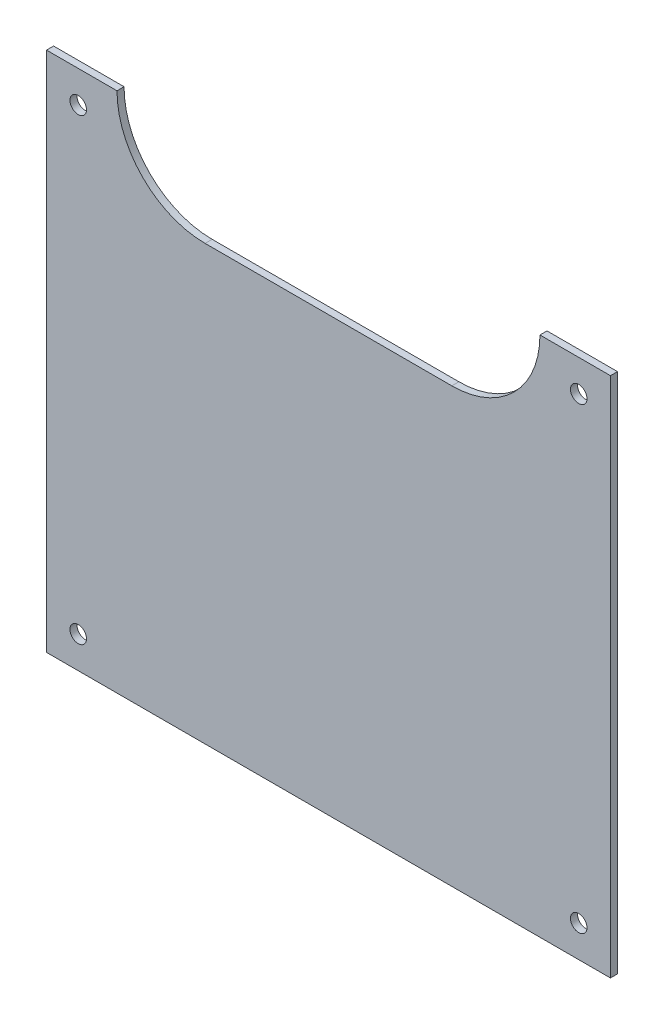
ISO-10303-21;
HEADER;
FILE_DESCRIPTION(('STEP AP214'),'2;1');
FILE_NAME('part.step','',(''),(''),'','','');
FILE_SCHEMA(('AUTOMOTIVE_DESIGN { 1 0 10303 214 1 1 1 1 }'));
ENDSEC;
DATA;
#1=APPLICATION_CONTEXT('core data for automotive mechanical design processes');
#2=APPLICATION_PROTOCOL_DEFINITION('international standard','automotive_design',2000,#1);
#3=PRODUCT_CONTEXT('',#1,'mechanical');
#4=PRODUCT('Part','Part','',(#3));
#5=PRODUCT_RELATED_PRODUCT_CATEGORY('part','',(#4));
#6=PRODUCT_DEFINITION_FORMATION('','',#4);
#7=PRODUCT_DEFINITION_CONTEXT('part definition',#1,'design');
#8=PRODUCT_DEFINITION('design','',#6,#7);
#9=PRODUCT_DEFINITION_SHAPE('','',#8);
#10=(LENGTH_UNIT() NAMED_UNIT(*) SI_UNIT(.MILLI.,.METRE.));
#11=(NAMED_UNIT(*) PLANE_ANGLE_UNIT() SI_UNIT($,.RADIAN.));
#12=(NAMED_UNIT(*) SI_UNIT($,.STERADIAN.) SOLID_ANGLE_UNIT());
#13=UNCERTAINTY_MEASURE_WITH_UNIT(LENGTH_MEASURE(1.E-05),#10,'distance_accuracy_value','');
#14=(GEOMETRIC_REPRESENTATION_CONTEXT(3) GLOBAL_UNCERTAINTY_ASSIGNED_CONTEXT((#13)) GLOBAL_UNIT_ASSIGNED_CONTEXT((#10,
#11,#12)) REPRESENTATION_CONTEXT('',''));
#15=CARTESIAN_POINT('',(0.,0.,0.));
#16=DIRECTION('',(0.,0.,1.));
#17=DIRECTION('',(1.,0.,0.));
#18=AXIS2_PLACEMENT_3D('',#15,#16,#17);
#19=CARTESIAN_POINT('',(-60.,74.,2.));
#20=DIRECTION('',(0.,-1.,0.));
#21=DIRECTION('',(1.,0.,0.));
#22=AXIS2_PLACEMENT_3D('',#19,#20,#21);
#23=PLANE('',#22);
#24=DIRECTION('',(-1.,0.,0.));
#25=VECTOR('',#24,1.);
#26=CARTESIAN_POINT('',(-60.,74.,0.));
#27=LINE('',#26,#25);
#28=CARTESIAN_POINT('',(-60.,74.,0.));
#29=VERTEX_POINT('',#28);
#30=CARTESIAN_POINT('',(-80.,74.,0.));
#31=VERTEX_POINT('',#30);
#32=EDGE_CURVE('E135',#29,#31,#27,.T.);
#33=ORIENTED_EDGE('',*,*,#32,.T.);
#34=DIRECTION('',(0.,0.,-1.));
#35=VECTOR('',#34,1.);
#36=CARTESIAN_POINT('',(-80.,74.,2.));
#37=LINE('',#36,#35);
#38=CARTESIAN_POINT('',(-80.,74.,2.));
#39=VERTEX_POINT('',#38);
#40=EDGE_CURVE('E11',#39,#31,#37,.T.);
#41=ORIENTED_EDGE('',*,*,#40,.F.);
#42=DIRECTION('',(-1.,0.,0.));
#43=VECTOR('',#42,1.);
#44=CARTESIAN_POINT('',(-60.,74.,2.));
#45=LINE('',#44,#43);
#46=CARTESIAN_POINT('',(-60.,74.,2.));
#47=VERTEX_POINT('',#46);
#48=EDGE_CURVE('E150',#47,#39,#45,.T.);
#49=ORIENTED_EDGE('',*,*,#48,.F.);
#50=DIRECTION('',(0.,0.,-1.));
#51=VECTOR('',#50,1.);
#52=CARTESIAN_POINT('',(-60.,74.,2.));
#53=LINE('',#52,#51);
#54=EDGE_CURVE('E131',#47,#29,#53,.T.);
#55=ORIENTED_EDGE('',*,*,#54,.T.);
#56=EDGE_LOOP('',(#33,#41,#49,#55));
#57=FACE_BOUND('',#56,.T.);
#58=ADVANCED_FACE('F39',(#57),#23,.F.);
#59=CARTESIAN_POINT('',(-80.,-74.,2.));
#60=DIRECTION('',(1.,0.,0.));
#61=DIRECTION('',(0.,0.,-1.));
#62=AXIS2_PLACEMENT_3D('',#59,#60,#61);
#63=PLANE('',#62);
#64=DIRECTION('',(0.,-1.,0.));
#65=VECTOR('',#64,1.);
#66=CARTESIAN_POINT('',(-80.,-74.,0.));
#67=LINE('',#66,#65);
#68=CARTESIAN_POINT('',(-80.,-74.,0.));
#69=VERTEX_POINT('',#68);
#70=EDGE_CURVE('E138',#31,#69,#67,.T.);
#71=ORIENTED_EDGE('',*,*,#70,.T.);
#72=DIRECTION('',(0.,0.,-1.));
#73=VECTOR('',#72,1.);
#74=CARTESIAN_POINT('',(-80.,-74.,2.));
#75=LINE('',#74,#73);
#76=CARTESIAN_POINT('',(-80.,-74.,2.));
#77=VERTEX_POINT('',#76);
#78=EDGE_CURVE('E47',#77,#69,#75,.T.);
#79=ORIENTED_EDGE('',*,*,#78,.F.);
#80=DIRECTION('',(0.,-1.,0.));
#81=VECTOR('',#80,1.);
#82=CARTESIAN_POINT('',(-80.,-74.,2.));
#83=LINE('',#82,#81);
#84=EDGE_CURVE('E98',#39,#77,#83,.T.);
#85=ORIENTED_EDGE('',*,*,#84,.F.);
#86=ORIENTED_EDGE('',*,*,#40,.T.);
#87=EDGE_LOOP('',(#71,#79,#85,#86));
#88=FACE_BOUND('',#87,.T.);
#89=ADVANCED_FACE('F232',(#88),#63,.F.);
#90=CARTESIAN_POINT('',(80.,-74.,2.));
#91=DIRECTION('',(0.,1.,0.));
#92=DIRECTION('',(-1.,0.,0.));
#93=AXIS2_PLACEMENT_3D('',#90,#91,#92);
#94=PLANE('',#93);
#95=DIRECTION('',(1.,0.,0.));
#96=VECTOR('',#95,1.);
#97=CARTESIAN_POINT('',(80.,-74.,0.));
#98=LINE('',#97,#96);
#99=CARTESIAN_POINT('',(80.,-74.,0.));
#100=VERTEX_POINT('',#99);
#101=EDGE_CURVE('E141',#69,#100,#98,.T.);
#102=ORIENTED_EDGE('',*,*,#101,.T.);
#103=DIRECTION('',(0.,0.,-1.));
#104=VECTOR('',#103,1.);
#105=CARTESIAN_POINT('',(80.,-74.,2.));
#106=LINE('',#105,#104);
#107=CARTESIAN_POINT('',(80.,-74.,2.));
#108=VERTEX_POINT('',#107);
#109=EDGE_CURVE('E157',#108,#100,#106,.T.);
#110=ORIENTED_EDGE('',*,*,#109,.F.);
#111=DIRECTION('',(1.,0.,0.));
#112=VECTOR('',#111,1.);
#113=CARTESIAN_POINT('',(80.,-74.,2.));
#114=LINE('',#113,#112);
#115=EDGE_CURVE('E165',#77,#108,#114,.T.);
#116=ORIENTED_EDGE('',*,*,#115,.F.);
#117=ORIENTED_EDGE('',*,*,#78,.T.);
#118=EDGE_LOOP('',(#102,#110,#116,#117));
#119=FACE_BOUND('',#118,.T.);
#120=ADVANCED_FACE('F163',(#119),#94,.F.);
#121=CARTESIAN_POINT('',(80.,-74.,2.));
#122=DIRECTION('',(-1.,0.,0.));
#123=DIRECTION('',(0.,0.,1.));
#124=AXIS2_PLACEMENT_3D('',#121,#122,#123);
#125=PLANE('',#124);
#126=DIRECTION('',(0.,1.,0.));
#127=VECTOR('',#126,1.);
#128=CARTESIAN_POINT('',(80.,-74.,0.));
#129=LINE('',#128,#127);
#130=CARTESIAN_POINT('',(80.,74.,0.));
#131=VERTEX_POINT('',#130);
#132=EDGE_CURVE('E143',#100,#131,#129,.T.);
#133=ORIENTED_EDGE('',*,*,#132,.T.);
#134=DIRECTION('',(0.,0.,-1.));
#135=VECTOR('',#134,1.);
#136=CARTESIAN_POINT('',(80.,74.,2.));
#137=LINE('',#136,#135);
#138=CARTESIAN_POINT('',(80.,74.,2.));
#139=VERTEX_POINT('',#138);
#140=EDGE_CURVE('E154',#139,#131,#137,.T.);
#141=ORIENTED_EDGE('',*,*,#140,.F.);
#142=DIRECTION('',(0.,1.,0.));
#143=VECTOR('',#142,1.);
#144=CARTESIAN_POINT('',(80.,-74.,2.));
#145=LINE('',#144,#143);
#146=EDGE_CURVE('E177',#108,#139,#145,.T.);
#147=ORIENTED_EDGE('',*,*,#146,.F.);
#148=ORIENTED_EDGE('',*,*,#109,.T.);
#149=EDGE_LOOP('',(#133,#141,#147,#148));
#150=FACE_BOUND('',#149,.T.);
#151=ADVANCED_FACE('F173',(#150),#125,.F.);
#152=CARTESIAN_POINT('',(80.,74.,2.));
#153=DIRECTION('',(0.,-1.,0.));
#154=DIRECTION('',(0.,0.,-1.));
#155=AXIS2_PLACEMENT_3D('',#152,#153,#154);
#156=PLANE('',#155);
#157=DIRECTION('',(-1.,0.,0.));
#158=VECTOR('',#157,1.);
#159=CARTESIAN_POINT('',(80.,74.,0.));
#160=LINE('',#159,#158);
#161=CARTESIAN_POINT('',(60.,74.,0.));
#162=VERTEX_POINT('',#161);
#163=EDGE_CURVE('E145',#131,#162,#160,.T.);
#164=ORIENTED_EDGE('',*,*,#163,.T.);
#165=DIRECTION('',(0.,0.,-1.));
#166=VECTOR('',#165,1.);
#167=CARTESIAN_POINT('',(60.,74.,2.));
#168=LINE('',#167,#166);
#169=CARTESIAN_POINT('',(60.,74.,2.));
#170=VERTEX_POINT('',#169);
#171=EDGE_CURVE('E126',#170,#162,#168,.T.);
#172=ORIENTED_EDGE('',*,*,#171,.F.);
#173=DIRECTION('',(-1.,0.,0.));
#174=VECTOR('',#173,1.);
#175=CARTESIAN_POINT('',(80.,74.,2.));
#176=LINE('',#175,#174);
#177=EDGE_CURVE('E117',#139,#170,#176,.T.);
#178=ORIENTED_EDGE('',*,*,#177,.F.);
#179=ORIENTED_EDGE('',*,*,#140,.T.);
#180=EDGE_LOOP('',(#164,#172,#178,#179));
#181=FACE_BOUND('',#180,.T.);
#182=ADVANCED_FACE('F176',(#181),#156,.F.);
#183=CARTESIAN_POINT('',(35.,74.,2.));
#184=DIRECTION('',(0.,0.,-1.));
#185=DIRECTION('',(-1.,0.,0.));
#186=AXIS2_PLACEMENT_3D('',#183,#184,#185);
#187=CYLINDRICAL_SURFACE('',#186,25.);
#188=CARTESIAN_POINT('',(35.,74.,0.));
#189=DIRECTION('',(0.,0.,-1.));
#190=DIRECTION('',(1.,0.,0.));
#191=AXIS2_PLACEMENT_3D('',#188,#189,#190);
#192=CIRCLE('',#191,25.);
#193=CARTESIAN_POINT('',(35.,49.,0.));
#194=VERTEX_POINT('',#193);
#195=EDGE_CURVE('E125',#162,#194,#192,.T.);
#196=ORIENTED_EDGE('',*,*,#195,.T.);
#197=DIRECTION('',(0.,0.,-1.));
#198=VECTOR('',#197,1.);
#199=CARTESIAN_POINT('',(35.,49.,2.));
#200=LINE('',#199,#198);
#201=CARTESIAN_POINT('',(35.,49.,2.));
#202=VERTEX_POINT('',#201);
#203=EDGE_CURVE('E122',#202,#194,#200,.T.);
#204=ORIENTED_EDGE('',*,*,#203,.F.);
#205=CARTESIAN_POINT('',(35.,74.,2.));
#206=DIRECTION('',(0.,0.,-1.));
#207=DIRECTION('',(1.,0.,0.));
#208=AXIS2_PLACEMENT_3D('',#205,#206,#207);
#209=CIRCLE('',#208,25.);
#210=EDGE_CURVE('E111',#170,#202,#209,.T.);
#211=ORIENTED_EDGE('',*,*,#210,.F.);
#212=ORIENTED_EDGE('',*,*,#171,.T.);
#213=EDGE_LOOP('',(#196,#204,#211,#212));
#214=FACE_BOUND('',#213,.T.);
#215=ADVANCED_FACE('F123',(#214),#187,.F.);
#216=CARTESIAN_POINT('',(-35.,49.,2.));
#217=DIRECTION('',(0.,-1.,0.));
#218=DIRECTION('',(1.,0.,0.));
#219=AXIS2_PLACEMENT_3D('',#216,#217,#218);
#220=PLANE('',#219);
#221=DIRECTION('',(-1.,0.,0.));
#222=VECTOR('',#221,1.);
#223=CARTESIAN_POINT('',(-35.,49.,0.));
#224=LINE('',#223,#222);
#225=CARTESIAN_POINT('',(-35.,49.,0.));
#226=VERTEX_POINT('',#225);
#227=EDGE_CURVE('E84',#194,#226,#224,.T.);
#228=ORIENTED_EDGE('',*,*,#227,.T.);
#229=DIRECTION('',(0.,0.,-1.));
#230=VECTOR('',#229,1.);
#231=CARTESIAN_POINT('',(-35.,49.,2.));
#232=LINE('',#231,#230);
#233=CARTESIAN_POINT('',(-35.,49.,2.));
#234=VERTEX_POINT('',#233);
#235=EDGE_CURVE('E127',#234,#226,#232,.T.);
#236=ORIENTED_EDGE('',*,*,#235,.F.);
#237=DIRECTION('',(-1.,0.,0.));
#238=VECTOR('',#237,1.);
#239=CARTESIAN_POINT('',(-35.,49.,2.));
#240=LINE('',#239,#238);
#241=EDGE_CURVE('E115',#202,#234,#240,.T.);
#242=ORIENTED_EDGE('',*,*,#241,.F.);
#243=ORIENTED_EDGE('',*,*,#203,.T.);
#244=EDGE_LOOP('',(#228,#236,#242,#243));
#245=FACE_BOUND('',#244,.T.);
#246=ADVANCED_FACE('F129',(#245),#220,.F.);
#247=CARTESIAN_POINT('',(-35.,74.,2.));
#248=DIRECTION('',(0.,0.,-1.));
#249=DIRECTION('',(-1.,0.,0.));
#250=AXIS2_PLACEMENT_3D('',#247,#248,#249);
#251=CYLINDRICAL_SURFACE('',#250,25.);
#252=CARTESIAN_POINT('',(-35.,74.,0.));
#253=DIRECTION('',(0.,0.,-1.));
#254=DIRECTION('',(1.,0.,0.));
#255=AXIS2_PLACEMENT_3D('',#252,#253,#254);
#256=CIRCLE('',#255,25.);
#257=EDGE_CURVE('E90',#226,#29,#256,.T.);
#258=ORIENTED_EDGE('',*,*,#257,.T.);
#259=ORIENTED_EDGE('',*,*,#54,.F.);
#260=CARTESIAN_POINT('',(-35.,74.,2.));
#261=DIRECTION('',(0.,0.,-1.));
#262=DIRECTION('',(1.,0.,0.));
#263=AXIS2_PLACEMENT_3D('',#260,#261,#262);
#264=CIRCLE('',#263,25.);
#265=EDGE_CURVE('E55',#234,#47,#264,.T.);
#266=ORIENTED_EDGE('',*,*,#265,.F.);
#267=ORIENTED_EDGE('',*,*,#235,.T.);
#268=EDGE_LOOP('',(#258,#259,#266,#267));
#269=FACE_BOUND('',#268,.T.);
#270=ADVANCED_FACE('F211',(#269),#251,.F.);
#271=CARTESIAN_POINT('',(35.,74.,2.));
#272=DIRECTION('',(0.,0.,1.));
#273=DIRECTION('',(1.,0.,0.));
#274=AXIS2_PLACEMENT_3D('',#271,#272,#273);
#275=PLANE('',#274);
#276=CARTESIAN_POINT('',(71.,-65.,2.));
#277=DIRECTION('',(0.,0.,1.));
#278=DIRECTION('',(1.,0.,0.));
#279=AXIS2_PLACEMENT_3D('',#276,#277,#278);
#280=CIRCLE('',#279,2.35);
#281=CARTESIAN_POINT('',(73.35,-65.,2.));
#282=VERTEX_POINT('',#281);
#283=EDGE_CURVE('E192',#282,#282,#280,.T.);
#284=ORIENTED_EDGE('',*,*,#283,.F.);
#285=EDGE_LOOP('',(#284));
#286=FACE_BOUND('',#285,.T.);
#287=CARTESIAN_POINT('',(-71.,-65.,2.));
#288=DIRECTION('',(0.,0.,1.));
#289=DIRECTION('',(1.,0.,0.));
#290=AXIS2_PLACEMENT_3D('',#287,#288,#289);
#291=CIRCLE('',#290,2.35);
#292=CARTESIAN_POINT('',(-68.65,-65.,2.));
#293=VERTEX_POINT('',#292);
#294=EDGE_CURVE('E198',#293,#293,#291,.T.);
#295=ORIENTED_EDGE('',*,*,#294,.F.);
#296=EDGE_LOOP('',(#295));
#297=FACE_BOUND('',#296,.T.);
#298=CARTESIAN_POINT('',(-71.,65.,2.));
#299=DIRECTION('',(0.,0.,1.));
#300=DIRECTION('',(1.,0.,0.));
#301=AXIS2_PLACEMENT_3D('',#298,#299,#300);
#302=CIRCLE('',#301,2.35);
#303=CARTESIAN_POINT('',(-68.65,65.,2.));
#304=VERTEX_POINT('',#303);
#305=EDGE_CURVE('E186',#304,#304,#302,.T.);
#306=ORIENTED_EDGE('',*,*,#305,.F.);
#307=EDGE_LOOP('',(#306));
#308=FACE_BOUND('',#307,.T.);
#309=CARTESIAN_POINT('',(71.,65.,2.));
#310=DIRECTION('',(0.,0.,1.));
#311=DIRECTION('',(1.,0.,0.));
#312=AXIS2_PLACEMENT_3D('',#309,#310,#311);
#313=CIRCLE('',#312,2.35);
#314=CARTESIAN_POINT('',(73.35,65.,2.));
#315=VERTEX_POINT('',#314);
#316=EDGE_CURVE('E183',#315,#315,#313,.T.);
#317=ORIENTED_EDGE('',*,*,#316,.F.);
#318=EDGE_LOOP('',(#317));
#319=FACE_BOUND('',#318,.T.);
#320=ORIENTED_EDGE('',*,*,#48,.T.);
#321=ORIENTED_EDGE('',*,*,#84,.T.);
#322=ORIENTED_EDGE('',*,*,#115,.T.);
#323=ORIENTED_EDGE('',*,*,#146,.T.);
#324=ORIENTED_EDGE('',*,*,#177,.T.);
#325=ORIENTED_EDGE('',*,*,#210,.T.);
#326=ORIENTED_EDGE('',*,*,#241,.T.);
#327=ORIENTED_EDGE('',*,*,#265,.T.);
#328=EDGE_LOOP('',(#320,#321,#322,#323,#324,#325,#326,#327));
#329=FACE_BOUND('',#328,.T.);
#330=ADVANCED_FACE('F113',(#286,#297,#308,#319,#329),#275,.T.);
#331=CARTESIAN_POINT('',(35.,74.,0.));
#332=DIRECTION('',(0.,0.,1.));
#333=DIRECTION('',(1.,0.,0.));
#334=AXIS2_PLACEMENT_3D('',#331,#332,#333);
#335=PLANE('',#334);
#336=CARTESIAN_POINT('',(71.,-65.,0.));
#337=DIRECTION('',(0.,0.,1.));
#338=DIRECTION('',(1.,0.,0.));
#339=AXIS2_PLACEMENT_3D('',#336,#337,#338);
#340=CIRCLE('',#339,2.35);
#341=CARTESIAN_POINT('',(73.35,-65.,0.));
#342=VERTEX_POINT('',#341);
#343=EDGE_CURVE('E189',#342,#342,#340,.T.);
#344=ORIENTED_EDGE('',*,*,#343,.T.);
#345=EDGE_LOOP('',(#344));
#346=FACE_BOUND('',#345,.T.);
#347=CARTESIAN_POINT('',(-71.,-65.,0.));
#348=DIRECTION('',(0.,0.,1.));
#349=DIRECTION('',(1.,0.,0.));
#350=AXIS2_PLACEMENT_3D('',#347,#348,#349);
#351=CIRCLE('',#350,2.35);
#352=CARTESIAN_POINT('',(-68.65,-65.,0.));
#353=VERTEX_POINT('',#352);
#354=EDGE_CURVE('E195',#353,#353,#351,.T.);
#355=ORIENTED_EDGE('',*,*,#354,.T.);
#356=EDGE_LOOP('',(#355));
#357=FACE_BOUND('',#356,.T.);
#358=CARTESIAN_POINT('',(-71.,65.,0.));
#359=DIRECTION('',(0.,0.,1.));
#360=DIRECTION('',(1.,0.,0.));
#361=AXIS2_PLACEMENT_3D('',#358,#359,#360);
#362=CIRCLE('',#361,2.35);
#363=CARTESIAN_POINT('',(-68.65,65.,0.));
#364=VERTEX_POINT('',#363);
#365=EDGE_CURVE('E201',#364,#364,#362,.T.);
#366=ORIENTED_EDGE('',*,*,#365,.T.);
#367=EDGE_LOOP('',(#366));
#368=FACE_BOUND('',#367,.T.);
#369=CARTESIAN_POINT('',(71.,65.,0.));
#370=DIRECTION('',(0.,0.,1.));
#371=DIRECTION('',(1.,0.,0.));
#372=AXIS2_PLACEMENT_3D('',#369,#370,#371);
#373=CIRCLE('',#372,2.35);
#374=CARTESIAN_POINT('',(73.35,65.,0.));
#375=VERTEX_POINT('',#374);
#376=EDGE_CURVE('E139',#375,#375,#373,.T.);
#377=ORIENTED_EDGE('',*,*,#376,.T.);
#378=EDGE_LOOP('',(#377));
#379=FACE_BOUND('',#378,.T.);
#380=ORIENTED_EDGE('',*,*,#32,.F.);
#381=ORIENTED_EDGE('',*,*,#257,.F.);
#382=ORIENTED_EDGE('',*,*,#227,.F.);
#383=ORIENTED_EDGE('',*,*,#195,.F.);
#384=ORIENTED_EDGE('',*,*,#163,.F.);
#385=ORIENTED_EDGE('',*,*,#132,.F.);
#386=ORIENTED_EDGE('',*,*,#101,.F.);
#387=ORIENTED_EDGE('',*,*,#70,.F.);
#388=EDGE_LOOP('',(#380,#381,#382,#383,#384,#385,#386,#387));
#389=FACE_BOUND('',#388,.T.);
#390=ADVANCED_FACE('F169',(#346,#357,#368,#379,#389),#335,.F.);
#391=CARTESIAN_POINT('',(71.,65.,0.));
#392=DIRECTION('',(0.,0.,1.));
#393=DIRECTION('',(1.,0.,0.));
#394=AXIS2_PLACEMENT_3D('',#391,#392,#393);
#395=CYLINDRICAL_SURFACE('',#394,2.35);
#396=ORIENTED_EDGE('',*,*,#376,.F.);
#397=EDGE_LOOP('',(#396));
#398=FACE_BOUND('',#397,.T.);
#399=ORIENTED_EDGE('',*,*,#316,.T.);
#400=EDGE_LOOP('',(#399));
#401=FACE_BOUND('',#400,.T.);
#402=ADVANCED_FACE('F216',(#398,#401),#395,.F.);
#403=CARTESIAN_POINT('',(-71.,65.,0.));
#404=DIRECTION('',(0.,0.,1.));
#405=DIRECTION('',(1.,0.,0.));
#406=AXIS2_PLACEMENT_3D('',#403,#404,#405);
#407=CYLINDRICAL_SURFACE('',#406,2.35);
#408=ORIENTED_EDGE('',*,*,#365,.F.);
#409=EDGE_LOOP('',(#408));
#410=FACE_BOUND('',#409,.T.);
#411=ORIENTED_EDGE('',*,*,#305,.T.);
#412=EDGE_LOOP('',(#411));
#413=FACE_BOUND('',#412,.T.);
#414=ADVANCED_FACE('F207',(#410,#413),#407,.F.);
#415=CARTESIAN_POINT('',(-71.,-65.,0.));
#416=DIRECTION('',(0.,0.,1.));
#417=DIRECTION('',(1.,0.,0.));
#418=AXIS2_PLACEMENT_3D('',#415,#416,#417);
#419=CYLINDRICAL_SURFACE('',#418,2.35);
#420=ORIENTED_EDGE('',*,*,#354,.F.);
#421=EDGE_LOOP('',(#420));
#422=FACE_BOUND('',#421,.T.);
#423=ORIENTED_EDGE('',*,*,#294,.T.);
#424=EDGE_LOOP('',(#423));
#425=FACE_BOUND('',#424,.T.);
#426=ADVANCED_FACE('F224',(#422,#425),#419,.F.);
#427=CARTESIAN_POINT('',(71.,-65.,0.));
#428=DIRECTION('',(0.,0.,1.));
#429=DIRECTION('',(1.,0.,0.));
#430=AXIS2_PLACEMENT_3D('',#427,#428,#429);
#431=CYLINDRICAL_SURFACE('',#430,2.35);
#432=ORIENTED_EDGE('',*,*,#343,.F.);
#433=EDGE_LOOP('',(#432));
#434=FACE_BOUND('',#433,.T.);
#435=ORIENTED_EDGE('',*,*,#283,.T.);
#436=EDGE_LOOP('',(#435));
#437=FACE_BOUND('',#436,.T.);
#438=ADVANCED_FACE('F313',(#434,#437),#431,.F.);
#439=CLOSED_SHELL('',(#58,#89,#120,#151,#182,#215,#246,#270,#330,#390,#402,#414,#426,#438));
#440=MANIFOLD_SOLID_BREP('B2',#439);
#441=ADVANCED_BREP_SHAPE_REPRESENTATION('',(#18,#440),#14);
#442=SHAPE_DEFINITION_REPRESENTATION(#9,#441);
ENDSEC;
END-ISO-10303-21;
